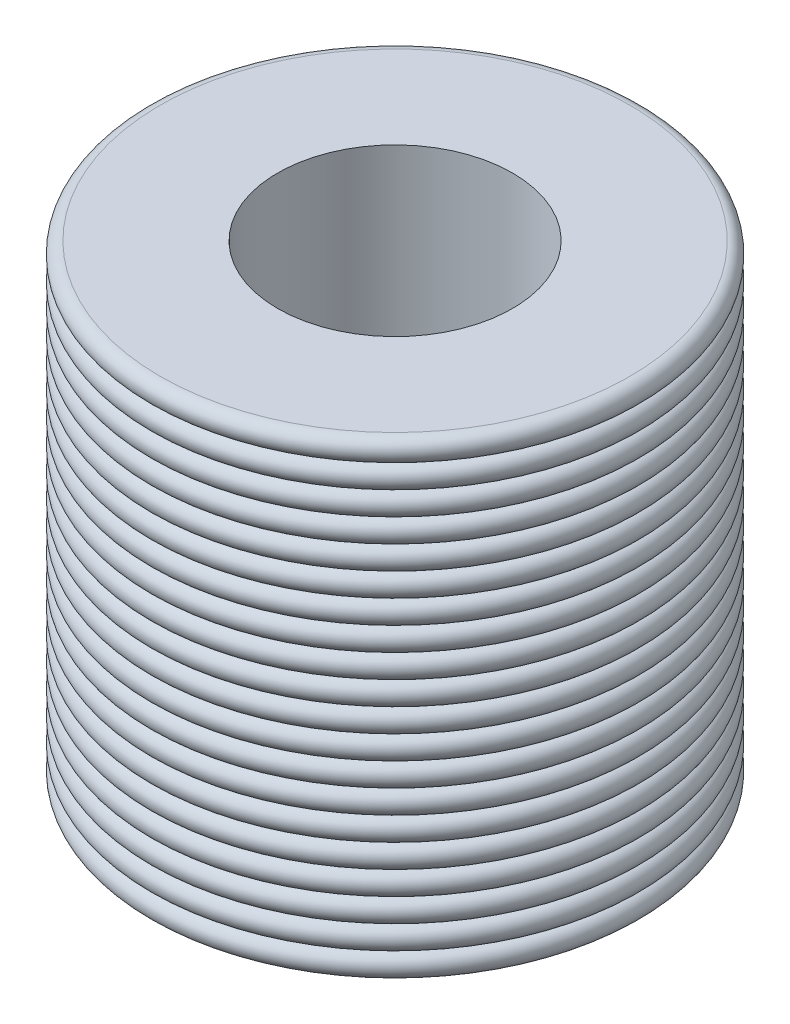
ISO-10303-21;
HEADER;
FILE_DESCRIPTION(('STEP AP214'),'2;1');
FILE_NAME('part.step','',(''),(''),'','','');
FILE_SCHEMA(('AUTOMOTIVE_DESIGN { 1 0 10303 214 1 1 1 1 }'));
ENDSEC;
DATA;
#1=APPLICATION_CONTEXT('core data for automotive mechanical design processes');
#2=APPLICATION_PROTOCOL_DEFINITION('international standard','automotive_design',2000,#1);
#3=PRODUCT_CONTEXT('',#1,'mechanical');
#4=PRODUCT('Part','Part','',(#3));
#5=PRODUCT_RELATED_PRODUCT_CATEGORY('part','',(#4));
#6=PRODUCT_DEFINITION_FORMATION('','',#4);
#7=PRODUCT_DEFINITION_CONTEXT('part definition',#1,'design');
#8=PRODUCT_DEFINITION('design','',#6,#7);
#9=PRODUCT_DEFINITION_SHAPE('','',#8);
#10=(LENGTH_UNIT() NAMED_UNIT(*) SI_UNIT(.MILLI.,.METRE.));
#11=(NAMED_UNIT(*) PLANE_ANGLE_UNIT() SI_UNIT($,.RADIAN.));
#12=(NAMED_UNIT(*) SI_UNIT($,.STERADIAN.) SOLID_ANGLE_UNIT());
#13=UNCERTAINTY_MEASURE_WITH_UNIT(LENGTH_MEASURE(1.E-05),#10,'distance_accuracy_value','');
#14=(GEOMETRIC_REPRESENTATION_CONTEXT(3) GLOBAL_UNCERTAINTY_ASSIGNED_CONTEXT((#13)) GLOBAL_UNIT_ASSIGNED_CONTEXT((#10,
#11,#12)) REPRESENTATION_CONTEXT('',''));
#15=CARTESIAN_POINT('',(0.,0.,0.));
#16=DIRECTION('',(0.,0.,1.));
#17=DIRECTION('',(1.,0.,0.));
#18=AXIS2_PLACEMENT_3D('',#15,#16,#17);
#19=CARTESIAN_POINT('',(0.,-13.3483146067416,0.));
#20=DIRECTION('',(0.,1.,0.));
#21=DIRECTION('',(0.,0.,1.));
#22=AXIS2_PLACEMENT_3D('',#19,#20,#21);
#23=TOROIDAL_SURFACE('',#22,20.,1.);
#24=CARTESIAN_POINT('',(0.,-14.3483146067416,0.));
#25=DIRECTION('',(0.,1.,0.));
#26=DIRECTION('',(0.,0.,1.));
#27=AXIS2_PLACEMENT_3D('',#24,#25,#26);
#28=CIRCLE('',#27,20.);
#29=CARTESIAN_POINT('',(0.,-14.3483146067416,20.));
#30=VERTEX_POINT('',#29);
#31=EDGE_CURVE('E10',#30,#30,#28,.T.);
#32=ORIENTED_EDGE('',*,*,#31,.T.);
#33=EDGE_LOOP('',(#32));
#34=FACE_BOUND('',#33,.T.);
#35=CARTESIAN_POINT('',(0.,-12.3483146067416,0.));
#36=DIRECTION('',(0.,1.,0.));
#37=DIRECTION('',(0.,0.,1.));
#38=AXIS2_PLACEMENT_3D('',#35,#36,#37);
#39=CIRCLE('',#38,20.);
#40=CARTESIAN_POINT('',(0.,-12.3483146067416,20.));
#41=VERTEX_POINT('',#40);
#42=EDGE_CURVE('E136',#41,#41,#39,.T.);
#43=ORIENTED_EDGE('',*,*,#42,.F.);
#44=EDGE_LOOP('',(#43));
#45=FACE_BOUND('',#44,.T.);
#46=ADVANCED_FACE('F40',(#34,#45),#23,.T.);
#47=CARTESIAN_POINT('',(0.,-15.3483146067416,0.));
#48=DIRECTION('',(0.,1.,0.));
#49=DIRECTION('',(0.,0.,1.));
#50=AXIS2_PLACEMENT_3D('',#47,#48,#49);
#51=TOROIDAL_SURFACE('',#50,20.,0.999999999999998);
#52=CARTESIAN_POINT('',(0.,-16.3483146067416,0.));
#53=DIRECTION('',(0.,1.,0.));
#54=DIRECTION('',(0.,0.,1.));
#55=AXIS2_PLACEMENT_3D('',#52,#53,#54);
#56=CIRCLE('',#55,20.);
#57=CARTESIAN_POINT('',(0.,-16.3483146067416,20.));
#58=VERTEX_POINT('',#57);
#59=EDGE_CURVE('E47',#58,#58,#56,.T.);
#60=ORIENTED_EDGE('',*,*,#59,.T.);
#61=EDGE_LOOP('',(#60));
#62=FACE_BOUND('',#61,.T.);
#63=ORIENTED_EDGE('',*,*,#31,.F.);
#64=EDGE_LOOP('',(#63));
#65=FACE_BOUND('',#64,.T.);
#66=ADVANCED_FACE('F144',(#62,#65),#51,.T.);
#67=CARTESIAN_POINT('',(0.,-16.3483146067416,0.));
#68=DIRECTION('',(0.,1.,0.));
#69=DIRECTION('',(0.,0.,1.));
#70=AXIS2_PLACEMENT_3D('',#67,#68,#69);
#71=PLANE('',#70);
#72=ORIENTED_EDGE('',*,*,#59,.F.);
#73=EDGE_LOOP('',(#72));
#74=FACE_BOUND('',#73,.T.);
#75=CARTESIAN_POINT('',(0.,-16.3483146067416,0.));
#76=DIRECTION('',(0.,1.,0.));
#77=DIRECTION('',(0.,0.,1.));
#78=AXIS2_PLACEMENT_3D('',#75,#76,#77);
#79=CIRCLE('',#78,10.);
#80=CARTESIAN_POINT('',(0.,-16.3483146067416,10.));
#81=VERTEX_POINT('',#80);
#82=EDGE_CURVE('E54',#81,#81,#79,.T.);
#83=ORIENTED_EDGE('',*,*,#82,.T.);
#84=EDGE_LOOP('',(#83));
#85=FACE_BOUND('',#84,.T.);
#86=ADVANCED_FACE('F148',(#74,#85),#71,.F.);
#87=CARTESIAN_POINT('',(0.,24.6629213483146,0.));
#88=DIRECTION('',(0.,1.,0.));
#89=DIRECTION('',(0.,0.,1.));
#90=AXIS2_PLACEMENT_3D('',#87,#88,#89);
#91=CYLINDRICAL_SURFACE('',#90,10.);
#92=ORIENTED_EDGE('',*,*,#82,.F.);
#93=EDGE_LOOP('',(#92));
#94=FACE_BOUND('',#93,.T.);
#95=CARTESIAN_POINT('',(0.,23.6516853932584,0.));
#96=DIRECTION('',(0.,1.,0.));
#97=DIRECTION('',(0.,0.,1.));
#98=AXIS2_PLACEMENT_3D('',#95,#96,#97);
#99=CIRCLE('',#98,10.);
#100=CARTESIAN_POINT('',(0.,23.6516853932584,10.));
#101=VERTEX_POINT('',#100);
#102=EDGE_CURVE('E61',#101,#101,#99,.T.);
#103=ORIENTED_EDGE('',*,*,#102,.T.);
#104=EDGE_LOOP('',(#103));
#105=FACE_BOUND('',#104,.T.);
#106=ADVANCED_FACE('F152',(#94,#105),#91,.F.);
#107=CARTESIAN_POINT('',(0.,23.6516853932584,0.));
#108=DIRECTION('',(0.,1.,0.));
#109=DIRECTION('',(0.,0.,1.));
#110=AXIS2_PLACEMENT_3D('',#107,#108,#109);
#111=PLANE('',#110);
#112=CARTESIAN_POINT('',(0.,23.6516853932584,0.));
#113=DIRECTION('',(0.,1.,0.));
#114=DIRECTION('',(0.,0.,1.));
#115=AXIS2_PLACEMENT_3D('',#112,#113,#114);
#116=CIRCLE('',#115,20.);
#117=CARTESIAN_POINT('',(0.,23.6516853932584,20.));
#118=VERTEX_POINT('',#117);
#119=EDGE_CURVE('E67',#118,#118,#116,.T.);
#120=ORIENTED_EDGE('',*,*,#119,.T.);
#121=EDGE_LOOP('',(#120));
#122=FACE_BOUND('',#121,.T.);
#123=ORIENTED_EDGE('',*,*,#102,.F.);
#124=EDGE_LOOP('',(#123));
#125=FACE_BOUND('',#124,.T.);
#126=ADVANCED_FACE('F159',(#122,#125),#111,.T.);
#127=CARTESIAN_POINT('',(0.,22.6516853932584,0.));
#128=DIRECTION('',(0.,1.,0.));
#129=DIRECTION('',(0.,0.,1.));
#130=AXIS2_PLACEMENT_3D('',#127,#128,#129);
#131=TOROIDAL_SURFACE('',#130,20.,0.999999999999999);
#132=CARTESIAN_POINT('',(0.,21.6516853932584,0.));
#133=DIRECTION('',(0.,1.,0.));
#134=DIRECTION('',(0.,0.,1.));
#135=AXIS2_PLACEMENT_3D('',#132,#133,#134);
#136=CIRCLE('',#135,20.);
#137=CARTESIAN_POINT('',(0.,21.6516853932584,20.));
#138=VERTEX_POINT('',#137);
#139=EDGE_CURVE('E71',#138,#138,#136,.T.);
#140=ORIENTED_EDGE('',*,*,#139,.T.);
#141=EDGE_LOOP('',(#140));
#142=FACE_BOUND('',#141,.T.);
#143=ORIENTED_EDGE('',*,*,#119,.F.);
#144=EDGE_LOOP('',(#143));
#145=FACE_BOUND('',#144,.T.);
#146=ADVANCED_FACE('F163',(#142,#145),#131,.T.);
#147=CARTESIAN_POINT('',(0.,20.6516853932584,0.));
#148=DIRECTION('',(0.,1.,0.));
#149=DIRECTION('',(0.,0.,1.));
#150=AXIS2_PLACEMENT_3D('',#147,#148,#149);
#151=TOROIDAL_SURFACE('',#150,20.,0.999999999999999);
#152=CARTESIAN_POINT('',(0.,19.6516853932584,0.));
#153=DIRECTION('',(0.,1.,0.));
#154=DIRECTION('',(0.,0.,1.));
#155=AXIS2_PLACEMENT_3D('',#152,#153,#154);
#156=CIRCLE('',#155,20.);
#157=CARTESIAN_POINT('',(0.,19.6516853932584,20.));
#158=VERTEX_POINT('',#157);
#159=EDGE_CURVE('E74',#158,#158,#156,.T.);
#160=ORIENTED_EDGE('',*,*,#159,.T.);
#161=EDGE_LOOP('',(#160));
#162=FACE_BOUND('',#161,.T.);
#163=ORIENTED_EDGE('',*,*,#139,.F.);
#164=EDGE_LOOP('',(#163));
#165=FACE_BOUND('',#164,.T.);
#166=ADVANCED_FACE('F167',(#162,#165),#151,.T.);
#167=CARTESIAN_POINT('',(0.,18.6516853932584,0.));
#168=DIRECTION('',(0.,1.,0.));
#169=DIRECTION('',(0.,0.,1.));
#170=AXIS2_PLACEMENT_3D('',#167,#168,#169);
#171=TOROIDAL_SURFACE('',#170,20.,1.);
#172=CARTESIAN_POINT('',(0.,17.6516853932584,0.));
#173=DIRECTION('',(0.,1.,0.));
#174=DIRECTION('',(0.,0.,1.));
#175=AXIS2_PLACEMENT_3D('',#172,#173,#174);
#176=CIRCLE('',#175,20.);
#177=CARTESIAN_POINT('',(0.,17.6516853932584,20.));
#178=VERTEX_POINT('',#177);
#179=EDGE_CURVE('E78',#178,#178,#176,.T.);
#180=ORIENTED_EDGE('',*,*,#179,.T.);
#181=EDGE_LOOP('',(#180));
#182=FACE_BOUND('',#181,.T.);
#183=ORIENTED_EDGE('',*,*,#159,.F.);
#184=EDGE_LOOP('',(#183));
#185=FACE_BOUND('',#184,.T.);
#186=ADVANCED_FACE('F171',(#182,#185),#171,.T.);
#187=CARTESIAN_POINT('',(0.,16.6516853932584,0.));
#188=DIRECTION('',(0.,1.,0.));
#189=DIRECTION('',(0.,0.,1.));
#190=AXIS2_PLACEMENT_3D('',#187,#188,#189);
#191=TOROIDAL_SURFACE('',#190,20.,1.);
#192=CARTESIAN_POINT('',(0.,15.6516853932584,0.));
#193=DIRECTION('',(0.,1.,0.));
#194=DIRECTION('',(0.,0.,1.));
#195=AXIS2_PLACEMENT_3D('',#192,#193,#194);
#196=CIRCLE('',#195,20.);
#197=CARTESIAN_POINT('',(0.,15.6516853932584,20.));
#198=VERTEX_POINT('',#197);
#199=EDGE_CURVE('E82',#198,#198,#196,.T.);
#200=ORIENTED_EDGE('',*,*,#199,.T.);
#201=EDGE_LOOP('',(#200));
#202=FACE_BOUND('',#201,.T.);
#203=ORIENTED_EDGE('',*,*,#179,.F.);
#204=EDGE_LOOP('',(#203));
#205=FACE_BOUND('',#204,.T.);
#206=ADVANCED_FACE('F175',(#202,#205),#191,.T.);
#207=CARTESIAN_POINT('',(0.,14.6516853932584,0.));
#208=DIRECTION('',(0.,1.,0.));
#209=DIRECTION('',(0.,0.,1.));
#210=AXIS2_PLACEMENT_3D('',#207,#208,#209);
#211=TOROIDAL_SURFACE('',#210,20.,0.999999999999999);
#212=CARTESIAN_POINT('',(0.,13.6516853932584,0.));
#213=DIRECTION('',(0.,1.,0.));
#214=DIRECTION('',(0.,0.,1.));
#215=AXIS2_PLACEMENT_3D('',#212,#213,#214);
#216=CIRCLE('',#215,20.);
#217=CARTESIAN_POINT('',(0.,13.6516853932584,20.));
#218=VERTEX_POINT('',#217);
#219=EDGE_CURVE('E86',#218,#218,#216,.T.);
#220=ORIENTED_EDGE('',*,*,#219,.T.);
#221=EDGE_LOOP('',(#220));
#222=FACE_BOUND('',#221,.T.);
#223=ORIENTED_EDGE('',*,*,#199,.F.);
#224=EDGE_LOOP('',(#223));
#225=FACE_BOUND('',#224,.T.);
#226=ADVANCED_FACE('F179',(#222,#225),#211,.T.);
#227=CARTESIAN_POINT('',(0.,12.6516853932584,0.));
#228=DIRECTION('',(0.,1.,0.));
#229=DIRECTION('',(0.,0.,1.));
#230=AXIS2_PLACEMENT_3D('',#227,#228,#229);
#231=TOROIDAL_SURFACE('',#230,20.,1.);
#232=CARTESIAN_POINT('',(0.,11.6516853932584,0.));
#233=DIRECTION('',(0.,1.,0.));
#234=DIRECTION('',(0.,0.,1.));
#235=AXIS2_PLACEMENT_3D('',#232,#233,#234);
#236=CIRCLE('',#235,20.);
#237=CARTESIAN_POINT('',(0.,11.6516853932584,20.));
#238=VERTEX_POINT('',#237);
#239=EDGE_CURVE('E90',#238,#238,#236,.T.);
#240=ORIENTED_EDGE('',*,*,#239,.T.);
#241=EDGE_LOOP('',(#240));
#242=FACE_BOUND('',#241,.T.);
#243=ORIENTED_EDGE('',*,*,#219,.F.);
#244=EDGE_LOOP('',(#243));
#245=FACE_BOUND('',#244,.T.);
#246=ADVANCED_FACE('F183',(#242,#245),#231,.T.);
#247=CARTESIAN_POINT('',(0.,10.6516853932584,0.));
#248=DIRECTION('',(0.,1.,0.));
#249=DIRECTION('',(0.,0.,1.));
#250=AXIS2_PLACEMENT_3D('',#247,#248,#249);
#251=TOROIDAL_SURFACE('',#250,20.,1.);
#252=CARTESIAN_POINT('',(0.,9.65168539325844,0.));
#253=DIRECTION('',(0.,1.,0.));
#254=DIRECTION('',(0.,0.,1.));
#255=AXIS2_PLACEMENT_3D('',#252,#253,#254);
#256=CIRCLE('',#255,20.);
#257=CARTESIAN_POINT('',(0.,9.65168539325844,20.));
#258=VERTEX_POINT('',#257);
#259=EDGE_CURVE('E94',#258,#258,#256,.T.);
#260=ORIENTED_EDGE('',*,*,#259,.T.);
#261=EDGE_LOOP('',(#260));
#262=FACE_BOUND('',#261,.T.);
#263=ORIENTED_EDGE('',*,*,#239,.F.);
#264=EDGE_LOOP('',(#263));
#265=FACE_BOUND('',#264,.T.);
#266=ADVANCED_FACE('F187',(#262,#265),#251,.T.);
#267=CARTESIAN_POINT('',(0.,8.65168539325844,0.));
#268=DIRECTION('',(0.,1.,0.));
#269=DIRECTION('',(0.,0.,1.));
#270=AXIS2_PLACEMENT_3D('',#267,#268,#269);
#271=TOROIDAL_SURFACE('',#270,20.,1.);
#272=CARTESIAN_POINT('',(0.,7.65168539325844,0.));
#273=DIRECTION('',(0.,1.,0.));
#274=DIRECTION('',(0.,0.,1.));
#275=AXIS2_PLACEMENT_3D('',#272,#273,#274);
#276=CIRCLE('',#275,20.);
#277=CARTESIAN_POINT('',(0.,7.65168539325844,20.));
#278=VERTEX_POINT('',#277);
#279=EDGE_CURVE('E98',#278,#278,#276,.T.);
#280=ORIENTED_EDGE('',*,*,#279,.T.);
#281=EDGE_LOOP('',(#280));
#282=FACE_BOUND('',#281,.T.);
#283=ORIENTED_EDGE('',*,*,#259,.F.);
#284=EDGE_LOOP('',(#283));
#285=FACE_BOUND('',#284,.T.);
#286=ADVANCED_FACE('F191',(#282,#285),#271,.T.);
#287=CARTESIAN_POINT('',(0.,6.65168539325844,0.));
#288=DIRECTION('',(0.,1.,0.));
#289=DIRECTION('',(0.,0.,1.));
#290=AXIS2_PLACEMENT_3D('',#287,#288,#289);
#291=TOROIDAL_SURFACE('',#290,20.,1.);
#292=CARTESIAN_POINT('',(0.,5.65168539325844,0.));
#293=DIRECTION('',(0.,1.,0.));
#294=DIRECTION('',(0.,0.,1.));
#295=AXIS2_PLACEMENT_3D('',#292,#293,#294);
#296=CIRCLE('',#295,20.);
#297=CARTESIAN_POINT('',(0.,5.65168539325844,20.));
#298=VERTEX_POINT('',#297);
#299=EDGE_CURVE('E102',#298,#298,#296,.T.);
#300=ORIENTED_EDGE('',*,*,#299,.T.);
#301=EDGE_LOOP('',(#300));
#302=FACE_BOUND('',#301,.T.);
#303=ORIENTED_EDGE('',*,*,#279,.F.);
#304=EDGE_LOOP('',(#303));
#305=FACE_BOUND('',#304,.T.);
#306=ADVANCED_FACE('F195',(#302,#305),#291,.T.);
#307=CARTESIAN_POINT('',(0.,4.65168539325844,0.));
#308=DIRECTION('',(0.,1.,0.));
#309=DIRECTION('',(0.,0.,1.));
#310=AXIS2_PLACEMENT_3D('',#307,#308,#309);
#311=TOROIDAL_SURFACE('',#310,20.,1.);
#312=CARTESIAN_POINT('',(0.,3.65168539325844,0.));
#313=DIRECTION('',(0.,1.,0.));
#314=DIRECTION('',(0.,0.,1.));
#315=AXIS2_PLACEMENT_3D('',#312,#313,#314);
#316=CIRCLE('',#315,20.);
#317=CARTESIAN_POINT('',(0.,3.65168539325844,20.));
#318=VERTEX_POINT('',#317);
#319=EDGE_CURVE('E105',#318,#318,#316,.T.);
#320=ORIENTED_EDGE('',*,*,#319,.T.);
#321=EDGE_LOOP('',(#320));
#322=FACE_BOUND('',#321,.T.);
#323=ORIENTED_EDGE('',*,*,#299,.F.);
#324=EDGE_LOOP('',(#323));
#325=FACE_BOUND('',#324,.T.);
#326=ADVANCED_FACE('F199',(#322,#325),#311,.T.);
#327=CARTESIAN_POINT('',(0.,2.65168539325844,0.));
#328=DIRECTION('',(0.,1.,0.));
#329=DIRECTION('',(0.,0.,1.));
#330=AXIS2_PLACEMENT_3D('',#327,#328,#329);
#331=TOROIDAL_SURFACE('',#330,20.,0.999999999999999);
#332=CARTESIAN_POINT('',(0.,1.65168539325844,0.));
#333=DIRECTION('',(0.,1.,0.));
#334=DIRECTION('',(0.,0.,1.));
#335=AXIS2_PLACEMENT_3D('',#332,#333,#334);
#336=CIRCLE('',#335,20.);
#337=CARTESIAN_POINT('',(0.,1.65168539325844,20.));
#338=VERTEX_POINT('',#337);
#339=EDGE_CURVE('E109',#338,#338,#336,.T.);
#340=ORIENTED_EDGE('',*,*,#339,.T.);
#341=EDGE_LOOP('',(#340));
#342=FACE_BOUND('',#341,.T.);
#343=ORIENTED_EDGE('',*,*,#319,.F.);
#344=EDGE_LOOP('',(#343));
#345=FACE_BOUND('',#344,.T.);
#346=ADVANCED_FACE('F203',(#342,#345),#331,.T.);
#347=CARTESIAN_POINT('',(0.,0.651685393258441,0.));
#348=DIRECTION('',(0.,1.,0.));
#349=DIRECTION('',(0.,0.,1.));
#350=AXIS2_PLACEMENT_3D('',#347,#348,#349);
#351=TOROIDAL_SURFACE('',#350,20.,0.999999999999999);
#352=CARTESIAN_POINT('',(0.,-0.348314606741559,0.));
#353=DIRECTION('',(0.,1.,0.));
#354=DIRECTION('',(0.,0.,1.));
#355=AXIS2_PLACEMENT_3D('',#352,#353,#354);
#356=CIRCLE('',#355,20.);
#357=CARTESIAN_POINT('',(0.,-0.348314606741559,20.));
#358=VERTEX_POINT('',#357);
#359=EDGE_CURVE('E113',#358,#358,#356,.T.);
#360=ORIENTED_EDGE('',*,*,#359,.T.);
#361=EDGE_LOOP('',(#360));
#362=FACE_BOUND('',#361,.T.);
#363=ORIENTED_EDGE('',*,*,#339,.F.);
#364=EDGE_LOOP('',(#363));
#365=FACE_BOUND('',#364,.T.);
#366=ADVANCED_FACE('F207',(#362,#365),#351,.T.);
#367=CARTESIAN_POINT('',(0.,-1.34831460674156,0.));
#368=DIRECTION('',(0.,1.,0.));
#369=DIRECTION('',(0.,0.,1.));
#370=AXIS2_PLACEMENT_3D('',#367,#368,#369);
#371=TOROIDAL_SURFACE('',#370,20.,1.);
#372=CARTESIAN_POINT('',(0.,-2.34831460674156,0.));
#373=DIRECTION('',(0.,1.,0.));
#374=DIRECTION('',(0.,0.,1.));
#375=AXIS2_PLACEMENT_3D('',#372,#373,#374);
#376=CIRCLE('',#375,20.);
#377=CARTESIAN_POINT('',(0.,-2.34831460674156,20.));
#378=VERTEX_POINT('',#377);
#379=EDGE_CURVE('E117',#378,#378,#376,.T.);
#380=ORIENTED_EDGE('',*,*,#379,.T.);
#381=EDGE_LOOP('',(#380));
#382=FACE_BOUND('',#381,.T.);
#383=ORIENTED_EDGE('',*,*,#359,.F.);
#384=EDGE_LOOP('',(#383));
#385=FACE_BOUND('',#384,.T.);
#386=ADVANCED_FACE('F211',(#382,#385),#371,.T.);
#387=CARTESIAN_POINT('',(0.,-3.34831460674156,0.));
#388=DIRECTION('',(0.,1.,0.));
#389=DIRECTION('',(0.,0.,1.));
#390=AXIS2_PLACEMENT_3D('',#387,#388,#389);
#391=TOROIDAL_SURFACE('',#390,20.,1.);
#392=CARTESIAN_POINT('',(0.,-4.34831460674156,0.));
#393=DIRECTION('',(0.,1.,0.));
#394=DIRECTION('',(0.,0.,1.));
#395=AXIS2_PLACEMENT_3D('',#392,#393,#394);
#396=CIRCLE('',#395,20.);
#397=CARTESIAN_POINT('',(0.,-4.34831460674156,20.));
#398=VERTEX_POINT('',#397);
#399=EDGE_CURVE('E120',#398,#398,#396,.T.);
#400=ORIENTED_EDGE('',*,*,#399,.T.);
#401=EDGE_LOOP('',(#400));
#402=FACE_BOUND('',#401,.T.);
#403=ORIENTED_EDGE('',*,*,#379,.F.);
#404=EDGE_LOOP('',(#403));
#405=FACE_BOUND('',#404,.T.);
#406=ADVANCED_FACE('F215',(#402,#405),#391,.T.);
#407=CARTESIAN_POINT('',(0.,-5.34831460674156,0.));
#408=DIRECTION('',(0.,1.,0.));
#409=DIRECTION('',(0.,0.,1.));
#410=AXIS2_PLACEMENT_3D('',#407,#408,#409);
#411=TOROIDAL_SURFACE('',#410,20.,0.999999999999999);
#412=CARTESIAN_POINT('',(0.,-6.34831460674156,0.));
#413=DIRECTION('',(0.,1.,0.));
#414=DIRECTION('',(0.,0.,1.));
#415=AXIS2_PLACEMENT_3D('',#412,#413,#414);
#416=CIRCLE('',#415,20.);
#417=CARTESIAN_POINT('',(0.,-6.34831460674156,20.));
#418=VERTEX_POINT('',#417);
#419=EDGE_CURVE('E124',#418,#418,#416,.T.);
#420=ORIENTED_EDGE('',*,*,#419,.T.);
#421=EDGE_LOOP('',(#420));
#422=FACE_BOUND('',#421,.T.);
#423=ORIENTED_EDGE('',*,*,#399,.F.);
#424=EDGE_LOOP('',(#423));
#425=FACE_BOUND('',#424,.T.);
#426=ADVANCED_FACE('F219',(#422,#425),#411,.T.);
#427=CARTESIAN_POINT('',(0.,-7.34831460674156,0.));
#428=DIRECTION('',(0.,1.,0.));
#429=DIRECTION('',(0.,0.,1.));
#430=AXIS2_PLACEMENT_3D('',#427,#428,#429);
#431=TOROIDAL_SURFACE('',#430,20.,0.999999999999999);
#432=CARTESIAN_POINT('',(0.,-8.34831460674156,0.));
#433=DIRECTION('',(0.,1.,0.));
#434=DIRECTION('',(0.,0.,1.));
#435=AXIS2_PLACEMENT_3D('',#432,#433,#434);
#436=CIRCLE('',#435,20.);
#437=CARTESIAN_POINT('',(0.,-8.34831460674156,20.));
#438=VERTEX_POINT('',#437);
#439=EDGE_CURVE('E128',#438,#438,#436,.T.);
#440=ORIENTED_EDGE('',*,*,#439,.T.);
#441=EDGE_LOOP('',(#440));
#442=FACE_BOUND('',#441,.T.);
#443=ORIENTED_EDGE('',*,*,#419,.F.);
#444=EDGE_LOOP('',(#443));
#445=FACE_BOUND('',#444,.T.);
#446=ADVANCED_FACE('F223',(#442,#445),#431,.T.);
#447=CARTESIAN_POINT('',(0.,-9.34831460674156,0.));
#448=DIRECTION('',(0.,1.,0.));
#449=DIRECTION('',(0.,0.,1.));
#450=AXIS2_PLACEMENT_3D('',#447,#448,#449);
#451=TOROIDAL_SURFACE('',#450,20.,1.);
#452=CARTESIAN_POINT('',(0.,-10.3483146067416,0.));
#453=DIRECTION('',(0.,1.,0.));
#454=DIRECTION('',(0.,0.,1.));
#455=AXIS2_PLACEMENT_3D('',#452,#453,#454);
#456=CIRCLE('',#455,20.);
#457=CARTESIAN_POINT('',(0.,-10.3483146067416,20.));
#458=VERTEX_POINT('',#457);
#459=EDGE_CURVE('E132',#458,#458,#456,.T.);
#460=ORIENTED_EDGE('',*,*,#459,.T.);
#461=EDGE_LOOP('',(#460));
#462=FACE_BOUND('',#461,.T.);
#463=ORIENTED_EDGE('',*,*,#439,.F.);
#464=EDGE_LOOP('',(#463));
#465=FACE_BOUND('',#464,.T.);
#466=ADVANCED_FACE('F227',(#462,#465),#451,.T.);
#467=CARTESIAN_POINT('',(0.,-11.3483146067416,0.));
#468=DIRECTION('',(0.,1.,0.));
#469=DIRECTION('',(0.,0.,1.));
#470=AXIS2_PLACEMENT_3D('',#467,#468,#469);
#471=TOROIDAL_SURFACE('',#470,20.,1.);
#472=ORIENTED_EDGE('',*,*,#42,.T.);
#473=EDGE_LOOP('',(#472));
#474=FACE_BOUND('',#473,.T.);
#475=ORIENTED_EDGE('',*,*,#459,.F.);
#476=EDGE_LOOP('',(#475));
#477=FACE_BOUND('',#476,.T.);
#478=ADVANCED_FACE('F140',(#474,#477),#471,.T.);
#479=CLOSED_SHELL('',(#46,#66,#86,#106,#126,#146,#166,#186,#206,#226,#246,#266,#286,#306,#326,
#346,#366,#386,#406,#426,#446,#466,#478));
#480=MANIFOLD_SOLID_BREP('B2',#479);
#481=ADVANCED_BREP_SHAPE_REPRESENTATION('',(#18,#480),#14);
#482=SHAPE_DEFINITION_REPRESENTATION(#9,#481);
ENDSEC;
END-ISO-10303-21;
